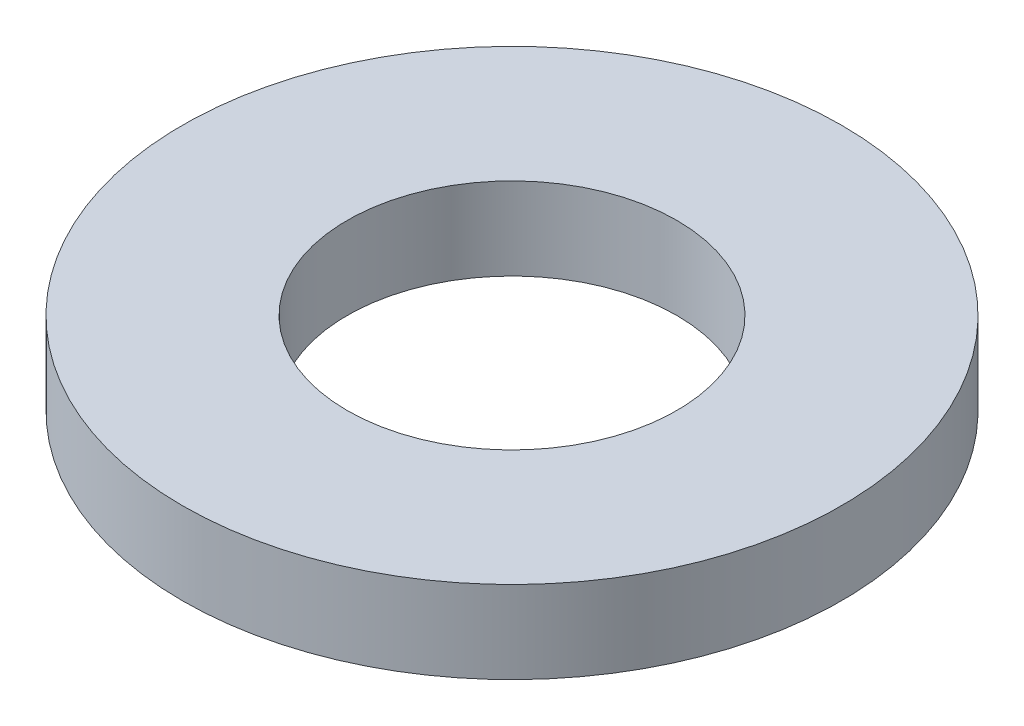
ISO-10303-21;
HEADER;
FILE_DESCRIPTION(('STEP AP214'),'2;1');
FILE_NAME('part.step','',(''),(''),'','','');
FILE_SCHEMA(('AUTOMOTIVE_DESIGN { 1 0 10303 214 1 1 1 1 }'));
ENDSEC;
DATA;
#1=APPLICATION_CONTEXT('core data for automotive mechanical design processes');
#2=APPLICATION_PROTOCOL_DEFINITION('international standard','automotive_design',2000,#1);
#3=PRODUCT_CONTEXT('',#1,'mechanical');
#4=PRODUCT('Part','Part','',(#3));
#5=PRODUCT_RELATED_PRODUCT_CATEGORY('part','',(#4));
#6=PRODUCT_DEFINITION_FORMATION('','',#4);
#7=PRODUCT_DEFINITION_CONTEXT('part definition',#1,'design');
#8=PRODUCT_DEFINITION('design','',#6,#7);
#9=PRODUCT_DEFINITION_SHAPE('','',#8);
#10=(LENGTH_UNIT() NAMED_UNIT(*) SI_UNIT(.MILLI.,.METRE.));
#11=(NAMED_UNIT(*) PLANE_ANGLE_UNIT() SI_UNIT($,.RADIAN.));
#12=(NAMED_UNIT(*) SI_UNIT($,.STERADIAN.) SOLID_ANGLE_UNIT());
#13=UNCERTAINTY_MEASURE_WITH_UNIT(LENGTH_MEASURE(1.E-05),#10,'distance_accuracy_value','');
#14=(GEOMETRIC_REPRESENTATION_CONTEXT(3) GLOBAL_UNCERTAINTY_ASSIGNED_CONTEXT((#13)) GLOBAL_UNIT_ASSIGNED_CONTEXT((#10,
#11,#12)) REPRESENTATION_CONTEXT('',''));
#15=CARTESIAN_POINT('',(0.,0.,0.));
#16=DIRECTION('',(0.,0.,1.));
#17=DIRECTION('',(1.,0.,0.));
#18=AXIS2_PLACEMENT_3D('',#15,#16,#17);
#19=CARTESIAN_POINT('',(0.,1.5875,0.));
#20=DIRECTION('',(0.,-1.,0.));
#21=DIRECTION('',(0.,0.,-1.));
#22=AXIS2_PLACEMENT_3D('',#19,#20,#21);
#23=CYLINDRICAL_SURFACE('',#22,6.35);
#24=CARTESIAN_POINT('',(0.,1.5875,0.));
#25=DIRECTION('',(0.,1.,0.));
#26=DIRECTION('',(0.,0.,1.));
#27=AXIS2_PLACEMENT_3D('',#24,#25,#26);
#28=CIRCLE('',#27,6.35);
#29=CARTESIAN_POINT('',(0.,1.5875,6.35));
#30=VERTEX_POINT('',#29);
#31=EDGE_CURVE('E10',#30,#30,#28,.T.);
#32=ORIENTED_EDGE('',*,*,#31,.F.);
#33=EDGE_LOOP('',(#32));
#34=FACE_BOUND('',#33,.T.);
#35=CARTESIAN_POINT('',(0.,0.,0.));
#36=DIRECTION('',(0.,1.,0.));
#37=DIRECTION('',(0.,0.,1.));
#38=AXIS2_PLACEMENT_3D('',#35,#36,#37);
#39=CIRCLE('',#38,6.35);
#40=CARTESIAN_POINT('',(0.,0.,6.35));
#41=VERTEX_POINT('',#40);
#42=EDGE_CURVE('E39',#41,#41,#39,.T.);
#43=ORIENTED_EDGE('',*,*,#42,.T.);
#44=EDGE_LOOP('',(#43));
#45=FACE_BOUND('',#44,.T.);
#46=ADVANCED_FACE('F32',(#34,#45),#23,.T.);
#47=CARTESIAN_POINT('',(0.,1.5875,0.));
#48=DIRECTION('',(0.,1.,0.));
#49=DIRECTION('',(0.,0.,1.));
#50=AXIS2_PLACEMENT_3D('',#47,#48,#49);
#51=PLANE('',#50);
#52=CARTESIAN_POINT('',(0.,1.5875,0.));
#53=DIRECTION('',(0.,1.,0.));
#54=DIRECTION('',(0.,0.,1.));
#55=AXIS2_PLACEMENT_3D('',#52,#53,#54);
#56=CIRCLE('',#55,3.175);
#57=CARTESIAN_POINT('',(0.,1.5875,3.175));
#58=VERTEX_POINT('',#57);
#59=EDGE_CURVE('E45',#58,#58,#56,.T.);
#60=ORIENTED_EDGE('',*,*,#59,.F.);
#61=EDGE_LOOP('',(#60));
#62=FACE_BOUND('',#61,.T.);
#63=ORIENTED_EDGE('',*,*,#31,.T.);
#64=EDGE_LOOP('',(#63));
#65=FACE_BOUND('',#64,.T.);
#66=ADVANCED_FACE('F61',(#62,#65),#51,.T.);
#67=CARTESIAN_POINT('',(0.,0.,0.));
#68=DIRECTION('',(0.,1.,0.));
#69=DIRECTION('',(0.,0.,1.));
#70=AXIS2_PLACEMENT_3D('',#67,#68,#69);
#71=PLANE('',#70);
#72=CARTESIAN_POINT('',(0.,0.,0.));
#73=DIRECTION('',(0.,1.,0.));
#74=DIRECTION('',(0.,0.,1.));
#75=AXIS2_PLACEMENT_3D('',#72,#73,#74);
#76=CIRCLE('',#75,3.175);
#77=CARTESIAN_POINT('',(0.,0.,3.175));
#78=VERTEX_POINT('',#77);
#79=EDGE_CURVE('E35',#78,#78,#76,.T.);
#80=ORIENTED_EDGE('',*,*,#79,.T.);
#81=EDGE_LOOP('',(#80));
#82=FACE_BOUND('',#81,.T.);
#83=ORIENTED_EDGE('',*,*,#42,.F.);
#84=EDGE_LOOP('',(#83));
#85=FACE_BOUND('',#84,.T.);
#86=ADVANCED_FACE('F52',(#82,#85),#71,.F.);
#87=CARTESIAN_POINT('',(0.,-15.875,0.));
#88=DIRECTION('',(0.,1.,0.));
#89=DIRECTION('',(0.,0.,1.));
#90=AXIS2_PLACEMENT_3D('',#87,#88,#89);
#91=CYLINDRICAL_SURFACE('',#90,3.175);
#92=ORIENTED_EDGE('',*,*,#59,.T.);
#93=EDGE_LOOP('',(#92));
#94=FACE_BOUND('',#93,.T.);
#95=ORIENTED_EDGE('',*,*,#79,.F.);
#96=EDGE_LOOP('',(#95));
#97=FACE_BOUND('',#96,.T.);
#98=ADVANCED_FACE('F55',(#94,#97),#91,.F.);
#99=CLOSED_SHELL('',(#46,#66,#86,#98));
#100=MANIFOLD_SOLID_BREP('B2',#99);
#101=ADVANCED_BREP_SHAPE_REPRESENTATION('',(#18,#100),#14);
#102=SHAPE_DEFINITION_REPRESENTATION(#9,#101);
ENDSEC;
END-ISO-10303-21;
